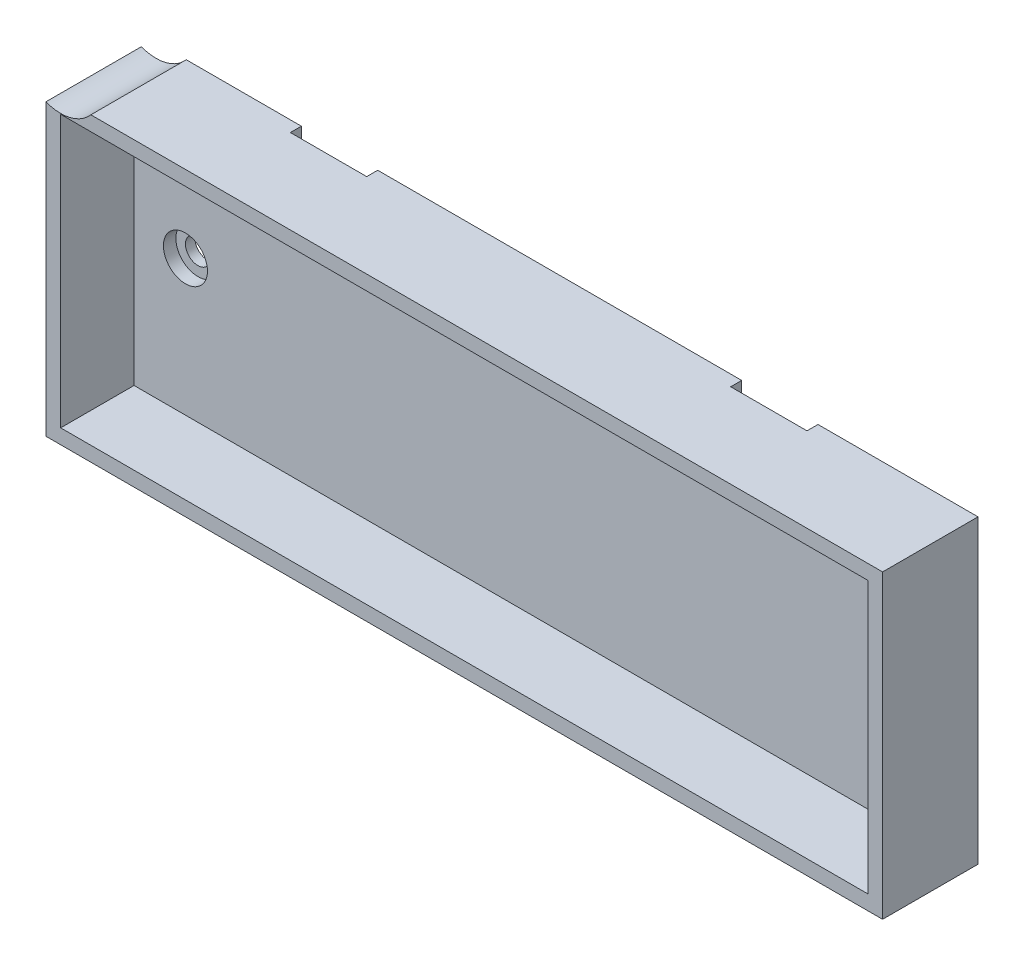
ISO-10303-21;
HEADER;
FILE_DESCRIPTION(('STEP AP214'),'2;1');
FILE_NAME('part.step','',(''),(''),'','','');
FILE_SCHEMA(('AUTOMOTIVE_DESIGN { 1 0 10303 214 1 1 1 1 }'));
ENDSEC;
DATA;
#1=APPLICATION_CONTEXT('core data for automotive mechanical design processes');
#2=APPLICATION_PROTOCOL_DEFINITION('international standard','automotive_design',2000,#1);
#3=PRODUCT_CONTEXT('',#1,'mechanical');
#4=PRODUCT('Part','Part','',(#3));
#5=PRODUCT_RELATED_PRODUCT_CATEGORY('part','',(#4));
#6=PRODUCT_DEFINITION_FORMATION('','',#4);
#7=PRODUCT_DEFINITION_CONTEXT('part definition',#1,'design');
#8=PRODUCT_DEFINITION('design','',#6,#7);
#9=PRODUCT_DEFINITION_SHAPE('','',#8);
#10=(LENGTH_UNIT() NAMED_UNIT(*) SI_UNIT(.MILLI.,.METRE.));
#11=(NAMED_UNIT(*) PLANE_ANGLE_UNIT() SI_UNIT($,.RADIAN.));
#12=(NAMED_UNIT(*) SI_UNIT($,.STERADIAN.) SOLID_ANGLE_UNIT());
#13=UNCERTAINTY_MEASURE_WITH_UNIT(LENGTH_MEASURE(1.E-05),#10,'distance_accuracy_value','');
#14=(GEOMETRIC_REPRESENTATION_CONTEXT(3) GLOBAL_UNCERTAINTY_ASSIGNED_CONTEXT((#13)) GLOBAL_UNIT_ASSIGNED_CONTEXT((#10,
#11,#12)) REPRESENTATION_CONTEXT('',''));
#15=CARTESIAN_POINT('',(0.,0.,0.));
#16=DIRECTION('',(0.,0.,1.));
#17=DIRECTION('',(1.,0.,0.));
#18=AXIS2_PLACEMENT_3D('',#15,#16,#17);
#19=CARTESIAN_POINT('',(-269.999999999999,50.4999999999969,50.));
#20=DIRECTION('',(0.,0.,1.));
#21=DIRECTION('',(1.,0.,0.));
#22=AXIS2_PLACEMENT_3D('',#19,#20,#21);
#23=PLANE('',#22);
#24=DIRECTION('',(1.,0.,0.));
#25=VECTOR('',#24,1.);
#26=CARTESIAN_POINT('',(-272.,6.,50.));
#27=LINE('',#26,#25);
#28=CARTESIAN_POINT('',(-250.2,6.,50.));
#29=VERTEX_POINT('',#28);
#30=CARTESIAN_POINT('',(-239.8,6.,50.));
#31=VERTEX_POINT('',#30);
#32=EDGE_CURVE('E264',#29,#31,#27,.T.);
#33=ORIENTED_EDGE('',*,*,#32,.F.);
#34=DIRECTION('',(0.,1.,0.));
#35=VECTOR('',#34,1.);
#36=CARTESIAN_POINT('',(-250.2,47.,50.));
#37=LINE('',#36,#35);
#38=CARTESIAN_POINT('',(-250.2,47.0000000000001,50.));
#39=VERTEX_POINT('',#38);
#40=EDGE_CURVE('E230',#29,#39,#37,.T.);
#41=ORIENTED_EDGE('',*,*,#40,.T.);
#42=DIRECTION('',(-1.,0.,0.));
#43=VECTOR('',#42,1.);
#44=CARTESIAN_POINT('',(-265.887822961009,47.0000000000001,50.));
#45=LINE('',#44,#43);
#46=CARTESIAN_POINT('',(-239.8,47.,50.));
#47=VERTEX_POINT('',#46);
#48=EDGE_CURVE('E266',#47,#39,#45,.T.);
#49=ORIENTED_EDGE('',*,*,#48,.F.);
#50=DIRECTION('',(0.,-1.,0.));
#51=VECTOR('',#50,1.);
#52=CARTESIAN_POINT('',(-239.8,47.,50.));
#53=LINE('',#52,#51);
#54=EDGE_CURVE('E241',#47,#31,#53,.T.);
#55=ORIENTED_EDGE('',*,*,#54,.T.);
#56=EDGE_LOOP('',(#33,#41,#49,#55));
#57=FACE_BOUND('',#56,.T.);
#58=ADVANCED_FACE('F41',(#57),#23,.F.);
#59=CARTESIAN_POINT('',(-269.999999999999,50.4999999999969,51.5));
#60=DIRECTION('',(0.,0.,1.));
#61=DIRECTION('',(1.,0.,0.));
#62=AXIS2_PLACEMENT_3D('',#59,#60,#61);
#63=CYLINDRICAL_SURFACE('',#62,5.39999999999747);
#64=CARTESIAN_POINT('',(-269.999999999999,50.4999999999969,61.5));
#65=DIRECTION('',(0.,0.,-1.));
#66=DIRECTION('',(1.,0.,0.));
#67=AXIS2_PLACEMENT_3D('',#64,#65,#66);
#68=CIRCLE('',#67,5.39999999999747);
#69=CARTESIAN_POINT('',(-265.887822961009,47.0000000000001,61.5));
#70=VERTEX_POINT('',#69);
#71=CARTESIAN_POINT('',(-272.,45.4840255184062,61.5));
#72=VERTEX_POINT('',#71);
#73=EDGE_CURVE('E296',#70,#72,#68,.T.);
#74=ORIENTED_EDGE('',*,*,#73,.F.);
#75=DIRECTION('',(0.,0.,1.));
#76=VECTOR('',#75,1.);
#77=CARTESIAN_POINT('',(-265.887822961009,47.0000000000001,51.5));
#78=LINE('',#77,#76);
#79=CARTESIAN_POINT('',(-265.887822961009,47.0000000000001,48.5));
#80=VERTEX_POINT('',#79);
#81=EDGE_CURVE('E11',#80,#70,#78,.T.);
#82=ORIENTED_EDGE('',*,*,#81,.F.);
#83=CARTESIAN_POINT('',(-269.999999999999,50.4999999999969,48.5));
#84=DIRECTION('',(0.,0.,-1.));
#85=DIRECTION('',(1.,0.,0.));
#86=AXIS2_PLACEMENT_3D('',#83,#84,#85);
#87=CIRCLE('',#86,5.39999999999747);
#88=CARTESIAN_POINT('',(-272.,45.4840255184062,48.5));
#89=VERTEX_POINT('',#88);
#90=EDGE_CURVE('E178',#80,#89,#87,.T.);
#91=ORIENTED_EDGE('',*,*,#90,.T.);
#92=DIRECTION('',(0.,0.,1.));
#93=VECTOR('',#92,1.);
#94=CARTESIAN_POINT('',(-272.,45.4840255184062,51.5));
#95=LINE('',#94,#93);
#96=EDGE_CURVE('E44',#89,#72,#95,.T.);
#97=ORIENTED_EDGE('',*,*,#96,.T.);
#98=EDGE_LOOP('',(#74,#82,#91,#97));
#99=FACE_BOUND('',#98,.T.);
#100=ADVANCED_FACE('F43',(#99),#63,.F.);
#101=CARTESIAN_POINT('',(-265.887822961009,47.0000000000001,51.5));
#102=DIRECTION('',(0.,1.,0.));
#103=DIRECTION('',(-1.,0.,0.));
#104=AXIS2_PLACEMENT_3D('',#101,#102,#103);
#105=PLANE('',#104);
#106=DIRECTION('',(-1.,0.,0.));
#107=VECTOR('',#106,1.);
#108=CARTESIAN_POINT('',(-265.887822961009,47.0000000000001,61.5));
#109=LINE('',#108,#107);
#110=CARTESIAN_POINT('',(-158.,47.,61.5));
#111=VERTEX_POINT('',#110);
#112=EDGE_CURVE('E174',#111,#70,#109,.T.);
#113=ORIENTED_EDGE('',*,*,#112,.F.);
#114=DIRECTION('',(0.,0.,1.));
#115=VECTOR('',#114,1.);
#116=CARTESIAN_POINT('',(-158.,47.,51.5));
#117=LINE('',#116,#115);
#118=CARTESIAN_POINT('',(-158.,47.,48.5));
#119=VERTEX_POINT('',#118);
#120=EDGE_CURVE('E49',#119,#111,#117,.T.);
#121=ORIENTED_EDGE('',*,*,#120,.F.);
#122=DIRECTION('',(-1.,0.,0.));
#123=VECTOR('',#122,1.);
#124=CARTESIAN_POINT('',(-179.8,47.,48.5));
#125=LINE('',#124,#123);
#126=CARTESIAN_POINT('',(-179.8,47.,48.5));
#127=VERTEX_POINT('',#126);
#128=EDGE_CURVE('E211',#119,#127,#125,.T.);
#129=ORIENTED_EDGE('',*,*,#128,.T.);
#130=DIRECTION('',(0.,0.,1.));
#131=VECTOR('',#130,1.);
#132=CARTESIAN_POINT('',(-179.8,47.,49.8));
#133=LINE('',#132,#131);
#134=CARTESIAN_POINT('',(-179.8,47.,50.));
#135=VERTEX_POINT('',#134);
#136=EDGE_CURVE('E239',#127,#135,#133,.T.);
#137=ORIENTED_EDGE('',*,*,#136,.T.);
#138=CARTESIAN_POINT('',(-190.2,47.,50.));
#139=VERTEX_POINT('',#138);
#140=EDGE_CURVE('E267',#135,#139,#45,.T.);
#141=ORIENTED_EDGE('',*,*,#140,.T.);
#142=DIRECTION('',(0.,0.,1.));
#143=VECTOR('',#142,1.);
#144=CARTESIAN_POINT('',(-190.2,47.,49.8));
#145=LINE('',#144,#143);
#146=CARTESIAN_POINT('',(-190.2,47.,48.5));
#147=VERTEX_POINT('',#146);
#148=EDGE_CURVE('E250',#147,#139,#145,.T.);
#149=ORIENTED_EDGE('',*,*,#148,.F.);
#150=DIRECTION('',(-1.,0.,0.));
#151=VECTOR('',#150,1.);
#152=CARTESIAN_POINT('',(-239.8,47.,48.5));
#153=LINE('',#152,#151);
#154=CARTESIAN_POINT('',(-239.8,47.,48.5));
#155=VERTEX_POINT('',#154);
#156=EDGE_CURVE('E196',#147,#155,#153,.T.);
#157=ORIENTED_EDGE('',*,*,#156,.T.);
#158=DIRECTION('',(0.,0.,1.));
#159=VECTOR('',#158,1.);
#160=CARTESIAN_POINT('',(-239.8,47.,49.8));
#161=LINE('',#160,#159);
#162=EDGE_CURVE('E197',#155,#47,#161,.T.);
#163=ORIENTED_EDGE('',*,*,#162,.T.);
#164=ORIENTED_EDGE('',*,*,#48,.T.);
#165=DIRECTION('',(0.,0.,1.));
#166=VECTOR('',#165,1.);
#167=CARTESIAN_POINT('',(-250.2,47.,49.8));
#168=LINE('',#167,#166);
#169=CARTESIAN_POINT('',(-250.2,47.,48.5));
#170=VERTEX_POINT('',#169);
#171=EDGE_CURVE('E66',#170,#39,#168,.T.);
#172=ORIENTED_EDGE('',*,*,#171,.F.);
#173=DIRECTION('',(-1.,0.,0.));
#174=VECTOR('',#173,1.);
#175=CARTESIAN_POINT('',(-265.887822961009,47.0000000000001,48.5));
#176=LINE('',#175,#174);
#177=EDGE_CURVE('E195',#170,#80,#176,.T.);
#178=ORIENTED_EDGE('',*,*,#177,.T.);
#179=ORIENTED_EDGE('',*,*,#81,.T.);
#180=EDGE_LOOP('',(#113,#121,#129,#137,#141,#149,#157,#163,#164,#172,#178,#179));
#181=FACE_BOUND('',#180,.T.);
#182=ADVANCED_FACE('F323',(#181),#105,.T.);
#183=CARTESIAN_POINT('',(-158.,47.,51.5));
#184=DIRECTION('',(1.,0.,0.));
#185=DIRECTION('',(0.,0.,-1.));
#186=AXIS2_PLACEMENT_3D('',#183,#184,#185);
#187=PLANE('',#186);
#188=DIRECTION('',(0.,1.,0.));
#189=VECTOR('',#188,1.);
#190=CARTESIAN_POINT('',(-158.,47.,61.5));
#191=LINE('',#190,#189);
#192=CARTESIAN_POINT('',(-158.,6.,61.5));
#193=VERTEX_POINT('',#192);
#194=EDGE_CURVE('E306',#193,#111,#191,.T.);
#195=ORIENTED_EDGE('',*,*,#194,.F.);
#196=DIRECTION('',(0.,0.,1.));
#197=VECTOR('',#196,1.);
#198=CARTESIAN_POINT('',(-158.,6.,51.5));
#199=LINE('',#198,#197);
#200=CARTESIAN_POINT('',(-158.,6.,48.5));
#201=VERTEX_POINT('',#200);
#202=EDGE_CURVE('E314',#201,#193,#199,.T.);
#203=ORIENTED_EDGE('',*,*,#202,.F.);
#204=DIRECTION('',(0.,1.,0.));
#205=VECTOR('',#204,1.);
#206=CARTESIAN_POINT('',(-158.,47.,48.5));
#207=LINE('',#206,#205);
#208=EDGE_CURVE('E212',#201,#119,#207,.T.);
#209=ORIENTED_EDGE('',*,*,#208,.T.);
#210=ORIENTED_EDGE('',*,*,#120,.T.);
#211=EDGE_LOOP('',(#195,#203,#209,#210));
#212=FACE_BOUND('',#211,.T.);
#213=ADVANCED_FACE('F353',(#212),#187,.T.);
#214=CARTESIAN_POINT('',(-272.,6.,51.5));
#215=DIRECTION('',(0.,-1.,0.));
#216=DIRECTION('',(0.,0.,-1.));
#217=AXIS2_PLACEMENT_3D('',#214,#215,#216);
#218=PLANE('',#217);
#219=DIRECTION('',(1.,0.,0.));
#220=VECTOR('',#219,1.);
#221=CARTESIAN_POINT('',(-272.,6.,61.5));
#222=LINE('',#221,#220);
#223=CARTESIAN_POINT('',(-272.,6.,61.5));
#224=VERTEX_POINT('',#223);
#225=EDGE_CURVE('E305',#224,#193,#222,.T.);
#226=ORIENTED_EDGE('',*,*,#225,.F.);
#227=DIRECTION('',(0.,0.,1.));
#228=VECTOR('',#227,1.);
#229=CARTESIAN_POINT('',(-272.,6.,51.5));
#230=LINE('',#229,#228);
#231=CARTESIAN_POINT('',(-272.,6.,48.5));
#232=VERTEX_POINT('',#231);
#233=EDGE_CURVE('E172',#232,#224,#230,.T.);
#234=ORIENTED_EDGE('',*,*,#233,.F.);
#235=DIRECTION('',(1.,0.,0.));
#236=VECTOR('',#235,1.);
#237=CARTESIAN_POINT('',(-272.,6.,48.5));
#238=LINE('',#237,#236);
#239=CARTESIAN_POINT('',(-250.2,6.,48.5));
#240=VERTEX_POINT('',#239);
#241=EDGE_CURVE('E181',#232,#240,#238,.T.);
#242=ORIENTED_EDGE('',*,*,#241,.T.);
#243=DIRECTION('',(0.,0.,1.));
#244=VECTOR('',#243,1.);
#245=CARTESIAN_POINT('',(-250.2,6.,49.8));
#246=LINE('',#245,#244);
#247=EDGE_CURVE('E234',#240,#29,#246,.T.);
#248=ORIENTED_EDGE('',*,*,#247,.T.);
#249=ORIENTED_EDGE('',*,*,#32,.T.);
#250=DIRECTION('',(0.,0.,1.));
#251=VECTOR('',#250,1.);
#252=CARTESIAN_POINT('',(-239.8,6.,49.8));
#253=LINE('',#252,#251);
#254=CARTESIAN_POINT('',(-239.8,6.,48.5));
#255=VERTEX_POINT('',#254);
#256=EDGE_CURVE('E245',#255,#31,#253,.T.);
#257=ORIENTED_EDGE('',*,*,#256,.F.);
#258=DIRECTION('',(1.,0.,0.));
#259=VECTOR('',#258,1.);
#260=CARTESIAN_POINT('',(-239.8,6.,48.5));
#261=LINE('',#260,#259);
#262=CARTESIAN_POINT('',(-190.2,6.,48.5));
#263=VERTEX_POINT('',#262);
#264=EDGE_CURVE('E202',#255,#263,#261,.T.);
#265=ORIENTED_EDGE('',*,*,#264,.T.);
#266=DIRECTION('',(0.,0.,1.));
#267=VECTOR('',#266,1.);
#268=CARTESIAN_POINT('',(-190.2,6.,49.8));
#269=LINE('',#268,#267);
#270=CARTESIAN_POINT('',(-190.2,6.,50.));
#271=VERTEX_POINT('',#270);
#272=EDGE_CURVE('E249',#263,#271,#269,.T.);
#273=ORIENTED_EDGE('',*,*,#272,.T.);
#274=CARTESIAN_POINT('',(-179.8,6.,50.));
#275=VERTEX_POINT('',#274);
#276=EDGE_CURVE('E265',#271,#275,#27,.T.);
#277=ORIENTED_EDGE('',*,*,#276,.T.);
#278=DIRECTION('',(0.,0.,1.));
#279=VECTOR('',#278,1.);
#280=CARTESIAN_POINT('',(-179.8,6.,49.8));
#281=LINE('',#280,#279);
#282=CARTESIAN_POINT('',(-179.8,6.,48.5));
#283=VERTEX_POINT('',#282);
#284=EDGE_CURVE('E59',#283,#275,#281,.T.);
#285=ORIENTED_EDGE('',*,*,#284,.F.);
#286=DIRECTION('',(1.,0.,0.));
#287=VECTOR('',#286,1.);
#288=CARTESIAN_POINT('',(-179.8,6.,48.5));
#289=LINE('',#288,#287);
#290=EDGE_CURVE('E220',#283,#201,#289,.T.);
#291=ORIENTED_EDGE('',*,*,#290,.T.);
#292=ORIENTED_EDGE('',*,*,#202,.T.);
#293=EDGE_LOOP('',(#226,#234,#242,#248,#249,#257,#265,#273,#277,#285,#291,#292));
#294=FACE_BOUND('',#293,.T.);
#295=ADVANCED_FACE('F320',(#294),#218,.T.);
#296=CARTESIAN_POINT('',(-272.,45.4840255184062,51.5));
#297=DIRECTION('',(-1.,0.,0.));
#298=DIRECTION('',(0.,0.,1.));
#299=AXIS2_PLACEMENT_3D('',#296,#297,#298);
#300=PLANE('',#299);
#301=DIRECTION('',(0.,-1.,0.));
#302=VECTOR('',#301,1.);
#303=CARTESIAN_POINT('',(-272.,45.4840255184062,61.5));
#304=LINE('',#303,#302);
#305=EDGE_CURVE('E170',#72,#224,#304,.T.);
#306=ORIENTED_EDGE('',*,*,#305,.F.);
#307=ORIENTED_EDGE('',*,*,#96,.F.);
#308=DIRECTION('',(0.,-1.,0.));
#309=VECTOR('',#308,1.);
#310=CARTESIAN_POINT('',(-272.,45.4840255184062,48.5));
#311=LINE('',#310,#309);
#312=EDGE_CURVE('E164',#89,#232,#311,.T.);
#313=ORIENTED_EDGE('',*,*,#312,.T.);
#314=ORIENTED_EDGE('',*,*,#233,.T.);
#315=EDGE_LOOP('',(#306,#307,#313,#314));
#316=FACE_BOUND('',#315,.T.);
#317=ADVANCED_FACE('F163',(#316),#300,.T.);
#318=CARTESIAN_POINT('',(-269.999999999999,50.4999999999969,61.5));
#319=DIRECTION('',(0.,0.,1.));
#320=DIRECTION('',(1.,0.,0.));
#321=AXIS2_PLACEMENT_3D('',#318,#319,#320);
#322=PLANE('',#321);
#323=DIRECTION('',(-1.,0.,0.));
#324=VECTOR('',#323,1.);
#325=CARTESIAN_POINT('',(-270.,45.,61.5));
#326=LINE('',#325,#324);
#327=CARTESIAN_POINT('',(-160.,45.,61.5));
#328=VERTEX_POINT('',#327);
#329=CARTESIAN_POINT('',(-270.,45.,61.5));
#330=VERTEX_POINT('',#329);
#331=EDGE_CURVE('E283',#328,#330,#326,.T.);
#332=ORIENTED_EDGE('',*,*,#331,.F.);
#333=DIRECTION('',(0.,1.,0.));
#334=VECTOR('',#333,1.);
#335=CARTESIAN_POINT('',(-160.,45.,61.5));
#336=LINE('',#335,#334);
#337=CARTESIAN_POINT('',(-160.,8.,61.5));
#338=VERTEX_POINT('',#337);
#339=EDGE_CURVE('E273',#338,#328,#336,.T.);
#340=ORIENTED_EDGE('',*,*,#339,.F.);
#341=DIRECTION('',(1.,0.,0.));
#342=VECTOR('',#341,1.);
#343=CARTESIAN_POINT('',(-270.,8.,61.5));
#344=LINE('',#343,#342);
#345=CARTESIAN_POINT('',(-270.,8.,61.5));
#346=VERTEX_POINT('',#345);
#347=EDGE_CURVE('E288',#346,#338,#344,.T.);
#348=ORIENTED_EDGE('',*,*,#347,.F.);
#349=DIRECTION('',(0.,-1.,0.));
#350=VECTOR('',#349,1.);
#351=CARTESIAN_POINT('',(-270.,45.,61.5));
#352=LINE('',#351,#350);
#353=EDGE_CURVE('E286',#330,#346,#352,.T.);
#354=ORIENTED_EDGE('',*,*,#353,.F.);
#355=EDGE_LOOP('',(#332,#340,#348,#354));
#356=FACE_BOUND('',#355,.T.);
#357=ORIENTED_EDGE('',*,*,#73,.T.);
#358=ORIENTED_EDGE('',*,*,#305,.T.);
#359=ORIENTED_EDGE('',*,*,#225,.T.);
#360=ORIENTED_EDGE('',*,*,#194,.T.);
#361=ORIENTED_EDGE('',*,*,#112,.T.);
#362=EDGE_LOOP('',(#357,#358,#359,#360,#361));
#363=FACE_BOUND('',#362,.T.);
#364=ADVANCED_FACE('F319',(#356,#363),#322,.T.);
#365=CARTESIAN_POINT('',(-270.,45.,51.5));
#366=DIRECTION('',(0.,1.,0.));
#367=DIRECTION('',(0.,0.,1.));
#368=AXIS2_PLACEMENT_3D('',#365,#366,#367);
#369=PLANE('',#368);
#370=ORIENTED_EDGE('',*,*,#331,.T.);
#371=DIRECTION('',(0.,0.,1.));
#372=VECTOR('',#371,1.);
#373=CARTESIAN_POINT('',(-270.,45.,51.5));
#374=LINE('',#373,#372);
#375=CARTESIAN_POINT('',(-270.,45.,51.5));
#376=VERTEX_POINT('',#375);
#377=EDGE_CURVE('E284',#376,#330,#374,.T.);
#378=ORIENTED_EDGE('',*,*,#377,.F.);
#379=DIRECTION('',(-1.,0.,0.));
#380=VECTOR('',#379,1.);
#381=CARTESIAN_POINT('',(-270.,45.,51.5));
#382=LINE('',#381,#380);
#383=CARTESIAN_POINT('',(-160.,45.,51.5));
#384=VERTEX_POINT('',#383);
#385=EDGE_CURVE('E269',#384,#376,#382,.T.);
#386=ORIENTED_EDGE('',*,*,#385,.F.);
#387=DIRECTION('',(0.,0.,1.));
#388=VECTOR('',#387,1.);
#389=CARTESIAN_POINT('',(-160.,45.,51.5));
#390=LINE('',#389,#388);
#391=EDGE_CURVE('E294',#384,#328,#390,.T.);
#392=ORIENTED_EDGE('',*,*,#391,.T.);
#393=EDGE_LOOP('',(#370,#378,#386,#392));
#394=FACE_BOUND('',#393,.T.);
#395=ADVANCED_FACE('F391',(#394),#369,.F.);
#396=CARTESIAN_POINT('',(-160.,45.,51.5));
#397=DIRECTION('',(1.,0.,0.));
#398=DIRECTION('',(0.,0.,-1.));
#399=AXIS2_PLACEMENT_3D('',#396,#397,#398);
#400=PLANE('',#399);
#401=ORIENTED_EDGE('',*,*,#339,.T.);
#402=ORIENTED_EDGE('',*,*,#391,.F.);
#403=DIRECTION('',(0.,1.,0.));
#404=VECTOR('',#403,1.);
#405=CARTESIAN_POINT('',(-160.,45.,51.5));
#406=LINE('',#405,#404);
#407=CARTESIAN_POINT('',(-160.,8.,51.5));
#408=VERTEX_POINT('',#407);
#409=EDGE_CURVE('E278',#408,#384,#406,.T.);
#410=ORIENTED_EDGE('',*,*,#409,.F.);
#411=DIRECTION('',(0.,0.,1.));
#412=VECTOR('',#411,1.);
#413=CARTESIAN_POINT('',(-160.,8.,51.5));
#414=LINE('',#413,#412);
#415=EDGE_CURVE('E297',#408,#338,#414,.T.);
#416=ORIENTED_EDGE('',*,*,#415,.T.);
#417=EDGE_LOOP('',(#401,#402,#410,#416));
#418=FACE_BOUND('',#417,.T.);
#419=ADVANCED_FACE('F387',(#418),#400,.F.);
#420=CARTESIAN_POINT('',(-270.,8.,51.5));
#421=DIRECTION('',(0.,-1.,0.));
#422=DIRECTION('',(0.,0.,-1.));
#423=AXIS2_PLACEMENT_3D('',#420,#421,#422);
#424=PLANE('',#423);
#425=ORIENTED_EDGE('',*,*,#347,.T.);
#426=ORIENTED_EDGE('',*,*,#415,.F.);
#427=DIRECTION('',(1.,0.,0.));
#428=VECTOR('',#427,1.);
#429=CARTESIAN_POINT('',(-270.,8.,51.5));
#430=LINE('',#429,#428);
#431=CARTESIAN_POINT('',(-270.,8.,51.5));
#432=VERTEX_POINT('',#431);
#433=EDGE_CURVE('E280',#432,#408,#430,.T.);
#434=ORIENTED_EDGE('',*,*,#433,.F.);
#435=DIRECTION('',(0.,0.,1.));
#436=VECTOR('',#435,1.);
#437=CARTESIAN_POINT('',(-270.,8.,51.5));
#438=LINE('',#437,#436);
#439=EDGE_CURVE('E298',#432,#346,#438,.T.);
#440=ORIENTED_EDGE('',*,*,#439,.T.);
#441=EDGE_LOOP('',(#425,#426,#434,#440));
#442=FACE_BOUND('',#441,.T.);
#443=ADVANCED_FACE('F379',(#442),#424,.F.);
#444=CARTESIAN_POINT('',(-270.,45.,51.5));
#445=DIRECTION('',(-1.,0.,0.));
#446=DIRECTION('',(0.,0.,1.));
#447=AXIS2_PLACEMENT_3D('',#444,#445,#446);
#448=PLANE('',#447);
#449=ORIENTED_EDGE('',*,*,#353,.T.);
#450=ORIENTED_EDGE('',*,*,#439,.F.);
#451=DIRECTION('',(0.,-1.,0.));
#452=VECTOR('',#451,1.);
#453=CARTESIAN_POINT('',(-270.,45.,51.5));
#454=LINE('',#453,#452);
#455=EDGE_CURVE('E272',#376,#432,#454,.T.);
#456=ORIENTED_EDGE('',*,*,#455,.F.);
#457=ORIENTED_EDGE('',*,*,#377,.T.);
#458=EDGE_LOOP('',(#449,#450,#456,#457));
#459=FACE_BOUND('',#458,.T.);
#460=ADVANCED_FACE('F373',(#459),#448,.F.);
#461=ORIENTED_EDGE('',*,*,#140,.F.);
#462=DIRECTION('',(0.,-1.,0.));
#463=VECTOR('',#462,1.);
#464=CARTESIAN_POINT('',(-179.8,47.,50.));
#465=LINE('',#464,#463);
#466=EDGE_CURVE('E236',#135,#275,#465,.T.);
#467=ORIENTED_EDGE('',*,*,#466,.T.);
#468=ORIENTED_EDGE('',*,*,#276,.F.);
#469=DIRECTION('',(0.,1.,0.));
#470=VECTOR('',#469,1.);
#471=CARTESIAN_POINT('',(-190.2,47.,50.));
#472=LINE('',#471,#470);
#473=EDGE_CURVE('E247',#271,#139,#472,.T.);
#474=ORIENTED_EDGE('',*,*,#473,.T.);
#475=EDGE_LOOP('',(#461,#467,#468,#474));
#476=FACE_BOUND('',#475,.T.);
#477=ADVANCED_FACE('F345',(#476),#23,.F.);
#478=CARTESIAN_POINT('',(-269.999999999999,50.4999999999969,51.5));
#479=DIRECTION('',(0.,0.,1.));
#480=DIRECTION('',(1.,0.,0.));
#481=AXIS2_PLACEMENT_3D('',#478,#479,#480);
#482=PLANE('',#481);
#483=ORIENTED_EDGE('',*,*,#433,.T.);
#484=ORIENTED_EDGE('',*,*,#409,.T.);
#485=ORIENTED_EDGE('',*,*,#385,.T.);
#486=ORIENTED_EDGE('',*,*,#455,.T.);
#487=EDGE_LOOP('',(#483,#484,#485,#486));
#488=FACE_BOUND('',#487,.T.);
#489=CARTESIAN_POINT('',(-167.,26.5,51.5));
#490=DIRECTION('',(0.,0.,1.));
#491=DIRECTION('',(1.,0.,0.));
#492=AXIS2_PLACEMENT_3D('',#489,#490,#491);
#493=CIRCLE('',#492,3.);
#494=CARTESIAN_POINT('',(-164.,26.5,51.5));
#495=VERTEX_POINT('',#494);
#496=EDGE_CURVE('E235',#495,#495,#493,.T.);
#497=ORIENTED_EDGE('',*,*,#496,.F.);
#498=EDGE_LOOP('',(#497));
#499=FACE_BOUND('',#498,.T.);
#500=CARTESIAN_POINT('',(-263.,26.5,51.5));
#501=DIRECTION('',(0.,0.,1.));
#502=DIRECTION('',(1.,0.,0.));
#503=AXIS2_PLACEMENT_3D('',#500,#501,#502);
#504=CIRCLE('',#503,3.);
#505=CARTESIAN_POINT('',(-260.,26.5,51.5));
#506=VERTEX_POINT('',#505);
#507=EDGE_CURVE('E259',#506,#506,#504,.T.);
#508=ORIENTED_EDGE('',*,*,#507,.F.);
#509=EDGE_LOOP('',(#508));
#510=FACE_BOUND('',#509,.T.);
#511=ADVANCED_FACE('F375',(#488,#499,#510),#482,.T.);
#512=CARTESIAN_POINT('',(-263.,26.5,50.));
#513=DIRECTION('',(0.,0.,1.));
#514=DIRECTION('',(1.,0.,0.));
#515=AXIS2_PLACEMENT_3D('',#512,#513,#514);
#516=CYLINDRICAL_SURFACE('',#515,3.);
#517=ORIENTED_EDGE('',*,*,#507,.T.);
#518=EDGE_LOOP('',(#517));
#519=FACE_BOUND('',#518,.T.);
#520=CARTESIAN_POINT('',(-263.,26.5,49.8));
#521=DIRECTION('',(0.,0.,1.));
#522=DIRECTION('',(1.,0.,0.));
#523=AXIS2_PLACEMENT_3D('',#520,#521,#522);
#524=CIRCLE('',#523,3.);
#525=CARTESIAN_POINT('',(-260.,26.5,49.8));
#526=VERTEX_POINT('',#525);
#527=EDGE_CURVE('E227',#526,#526,#524,.T.);
#528=ORIENTED_EDGE('',*,*,#527,.F.);
#529=EDGE_LOOP('',(#528));
#530=FACE_BOUND('',#529,.T.);
#531=ADVANCED_FACE('F380',(#519,#530),#516,.F.);
#532=CARTESIAN_POINT('',(-167.,26.5,50.));
#533=DIRECTION('',(0.,0.,1.));
#534=DIRECTION('',(1.,0.,0.));
#535=AXIS2_PLACEMENT_3D('',#532,#533,#534);
#536=CYLINDRICAL_SURFACE('',#535,3.);
#537=ORIENTED_EDGE('',*,*,#496,.T.);
#538=EDGE_LOOP('',(#537));
#539=FACE_BOUND('',#538,.T.);
#540=CARTESIAN_POINT('',(-167.,26.5,49.8));
#541=DIRECTION('',(0.,0.,1.));
#542=DIRECTION('',(1.,0.,0.));
#543=AXIS2_PLACEMENT_3D('',#540,#541,#542);
#544=CIRCLE('',#543,3.);
#545=CARTESIAN_POINT('',(-164.,26.5,49.8));
#546=VERTEX_POINT('',#545);
#547=EDGE_CURVE('E231',#546,#546,#544,.T.);
#548=ORIENTED_EDGE('',*,*,#547,.F.);
#549=EDGE_LOOP('',(#548));
#550=FACE_BOUND('',#549,.T.);
#551=ADVANCED_FACE('F501',(#539,#550),#536,.F.);
#552=CARTESIAN_POINT('',(-239.8,47.,49.8));
#553=DIRECTION('',(-1.,0.,0.));
#554=DIRECTION('',(0.,0.,1.));
#555=AXIS2_PLACEMENT_3D('',#552,#553,#554);
#556=PLANE('',#555);
#557=ORIENTED_EDGE('',*,*,#54,.F.);
#558=ORIENTED_EDGE('',*,*,#162,.F.);
#559=DIRECTION('',(0.,-1.,0.));
#560=VECTOR('',#559,1.);
#561=CARTESIAN_POINT('',(-239.8,47.,48.5));
#562=LINE('',#561,#560);
#563=EDGE_CURVE('E208',#155,#255,#562,.T.);
#564=ORIENTED_EDGE('',*,*,#563,.T.);
#565=ORIENTED_EDGE('',*,*,#256,.T.);
#566=EDGE_LOOP('',(#557,#558,#564,#565));
#567=FACE_BOUND('',#566,.T.);
#568=ADVANCED_FACE('F332',(#567),#556,.T.);
#569=CARTESIAN_POINT('',(-190.2,47.,49.8));
#570=DIRECTION('',(1.,0.,0.));
#571=DIRECTION('',(0.,0.,-1.));
#572=AXIS2_PLACEMENT_3D('',#569,#570,#571);
#573=PLANE('',#572);
#574=ORIENTED_EDGE('',*,*,#473,.F.);
#575=ORIENTED_EDGE('',*,*,#272,.F.);
#576=DIRECTION('',(0.,1.,0.));
#577=VECTOR('',#576,1.);
#578=CARTESIAN_POINT('',(-190.2,47.,48.5));
#579=LINE('',#578,#577);
#580=EDGE_CURVE('E203',#263,#147,#579,.T.);
#581=ORIENTED_EDGE('',*,*,#580,.T.);
#582=ORIENTED_EDGE('',*,*,#148,.T.);
#583=EDGE_LOOP('',(#574,#575,#581,#582));
#584=FACE_BOUND('',#583,.T.);
#585=ADVANCED_FACE('F340',(#584),#573,.T.);
#586=CARTESIAN_POINT('',(-179.8,47.,49.8));
#587=DIRECTION('',(-1.,0.,0.));
#588=DIRECTION('',(0.,0.,1.));
#589=AXIS2_PLACEMENT_3D('',#586,#587,#588);
#590=PLANE('',#589);
#591=ORIENTED_EDGE('',*,*,#466,.F.);
#592=ORIENTED_EDGE('',*,*,#136,.F.);
#593=DIRECTION('',(0.,-1.,0.));
#594=VECTOR('',#593,1.);
#595=CARTESIAN_POINT('',(-179.8,47.,48.5));
#596=LINE('',#595,#594);
#597=EDGE_CURVE('E219',#127,#283,#596,.T.);
#598=ORIENTED_EDGE('',*,*,#597,.T.);
#599=ORIENTED_EDGE('',*,*,#284,.T.);
#600=EDGE_LOOP('',(#591,#592,#598,#599));
#601=FACE_BOUND('',#600,.T.);
#602=ADVANCED_FACE('F350',(#601),#590,.T.);
#603=CARTESIAN_POINT('',(-250.2,47.,49.8));
#604=DIRECTION('',(1.,0.,0.));
#605=DIRECTION('',(0.,0.,-1.));
#606=AXIS2_PLACEMENT_3D('',#603,#604,#605);
#607=PLANE('',#606);
#608=ORIENTED_EDGE('',*,*,#40,.F.);
#609=ORIENTED_EDGE('',*,*,#247,.F.);
#610=DIRECTION('',(0.,1.,0.));
#611=VECTOR('',#610,1.);
#612=CARTESIAN_POINT('',(-250.2,47.,48.5));
#613=LINE('',#612,#611);
#614=EDGE_CURVE('E194',#240,#170,#613,.T.);
#615=ORIENTED_EDGE('',*,*,#614,.T.);
#616=ORIENTED_EDGE('',*,*,#171,.T.);
#617=EDGE_LOOP('',(#608,#609,#615,#616));
#618=FACE_BOUND('',#617,.T.);
#619=ADVANCED_FACE('F326',(#618),#607,.T.);
#620=CARTESIAN_POINT('',(0.,0.,49.8));
#621=DIRECTION('',(0.,0.,1.));
#622=DIRECTION('',(1.,0.,0.));
#623=AXIS2_PLACEMENT_3D('',#620,#621,#622);
#624=PLANE('',#623);
#625=CARTESIAN_POINT('',(-167.,26.5,49.8));
#626=DIRECTION('',(0.,0.,1.));
#627=DIRECTION('',(1.,0.,0.));
#628=AXIS2_PLACEMENT_3D('',#625,#626,#627);
#629=CIRCLE('',#628,1.70000000000001);
#630=CARTESIAN_POINT('',(-165.3,26.5,49.8));
#631=VERTEX_POINT('',#630);
#632=EDGE_CURVE('E205',#631,#631,#629,.T.);
#633=ORIENTED_EDGE('',*,*,#632,.F.);
#634=EDGE_LOOP('',(#633));
#635=FACE_BOUND('',#634,.T.);
#636=ORIENTED_EDGE('',*,*,#547,.T.);
#637=EDGE_LOOP('',(#636));
#638=FACE_BOUND('',#637,.T.);
#639=ADVANCED_FACE('F547',(#635,#638),#624,.T.);
#640=CARTESIAN_POINT('',(0.,0.,48.5));
#641=DIRECTION('',(0.,0.,1.));
#642=DIRECTION('',(1.,0.,0.));
#643=AXIS2_PLACEMENT_3D('',#640,#641,#642);
#644=PLANE('',#643);
#645=CARTESIAN_POINT('',(-167.,26.5,48.5));
#646=DIRECTION('',(0.,0.,1.));
#647=DIRECTION('',(1.,0.,0.));
#648=AXIS2_PLACEMENT_3D('',#645,#646,#647);
#649=CIRCLE('',#648,1.70000000000001);
#650=CARTESIAN_POINT('',(-165.3,26.5,48.5));
#651=VERTEX_POINT('',#650);
#652=EDGE_CURVE('E225',#651,#651,#649,.T.);
#653=ORIENTED_EDGE('',*,*,#652,.T.);
#654=EDGE_LOOP('',(#653));
#655=FACE_BOUND('',#654,.T.);
#656=ORIENTED_EDGE('',*,*,#597,.F.);
#657=ORIENTED_EDGE('',*,*,#128,.F.);
#658=ORIENTED_EDGE('',*,*,#208,.F.);
#659=ORIENTED_EDGE('',*,*,#290,.F.);
#660=EDGE_LOOP('',(#656,#657,#658,#659));
#661=FACE_BOUND('',#660,.T.);
#662=ADVANCED_FACE('F351',(#655,#661),#644,.F.);
#663=CARTESIAN_POINT('',(-167.,26.5,48.5));
#664=DIRECTION('',(0.,0.,1.));
#665=DIRECTION('',(1.,0.,0.));
#666=AXIS2_PLACEMENT_3D('',#663,#664,#665);
#667=CYLINDRICAL_SURFACE('',#666,1.70000000000001);
#668=ORIENTED_EDGE('',*,*,#652,.F.);
#669=EDGE_LOOP('',(#668));
#670=FACE_BOUND('',#669,.T.);
#671=ORIENTED_EDGE('',*,*,#632,.T.);
#672=EDGE_LOOP('',(#671));
#673=FACE_BOUND('',#672,.T.);
#674=ADVANCED_FACE('F565',(#670,#673),#667,.F.);
#675=CARTESIAN_POINT('',(-269.999999999999,50.4999999999969,49.8));
#676=DIRECTION('',(0.,0.,1.));
#677=DIRECTION('',(1.,0.,0.));
#678=AXIS2_PLACEMENT_3D('',#675,#676,#677);
#679=PLANE('',#678);
#680=CARTESIAN_POINT('',(-263.,26.5,49.8));
#681=DIRECTION('',(0.,0.,1.));
#682=DIRECTION('',(1.,0.,0.));
#683=AXIS2_PLACEMENT_3D('',#680,#681,#682);
#684=CIRCLE('',#683,1.69999999999998);
#685=CARTESIAN_POINT('',(-261.3,26.5,49.8));
#686=VERTEX_POINT('',#685);
#687=EDGE_CURVE('E189',#686,#686,#684,.T.);
#688=ORIENTED_EDGE('',*,*,#687,.F.);
#689=EDGE_LOOP('',(#688));
#690=FACE_BOUND('',#689,.T.);
#691=ORIENTED_EDGE('',*,*,#527,.T.);
#692=EDGE_LOOP('',(#691));
#693=FACE_BOUND('',#692,.T.);
#694=ADVANCED_FACE('F573',(#690,#693),#679,.T.);
#695=CARTESIAN_POINT('',(-269.999999999999,50.4999999999969,48.5));
#696=DIRECTION('',(0.,0.,1.));
#697=DIRECTION('',(1.,0.,0.));
#698=AXIS2_PLACEMENT_3D('',#695,#696,#697);
#699=PLANE('',#698);
#700=CARTESIAN_POINT('',(-263.,26.5,48.5));
#701=DIRECTION('',(0.,0.,1.));
#702=DIRECTION('',(1.,0.,0.));
#703=AXIS2_PLACEMENT_3D('',#700,#701,#702);
#704=CIRCLE('',#703,1.69999999999998);
#705=CARTESIAN_POINT('',(-261.3,26.5,48.5));
#706=VERTEX_POINT('',#705);
#707=EDGE_CURVE('E183',#706,#706,#704,.T.);
#708=ORIENTED_EDGE('',*,*,#707,.T.);
#709=EDGE_LOOP('',(#708));
#710=FACE_BOUND('',#709,.T.);
#711=ORIENTED_EDGE('',*,*,#90,.F.);
#712=ORIENTED_EDGE('',*,*,#177,.F.);
#713=ORIENTED_EDGE('',*,*,#614,.F.);
#714=ORIENTED_EDGE('',*,*,#241,.F.);
#715=ORIENTED_EDGE('',*,*,#312,.F.);
#716=EDGE_LOOP('',(#711,#712,#713,#714,#715));
#717=FACE_BOUND('',#716,.T.);
#718=ADVANCED_FACE('F177',(#710,#717),#699,.F.);
#719=CARTESIAN_POINT('',(-263.,26.5,48.5));
#720=DIRECTION('',(0.,0.,1.));
#721=DIRECTION('',(1.,0.,0.));
#722=AXIS2_PLACEMENT_3D('',#719,#720,#721);
#723=CYLINDRICAL_SURFACE('',#722,1.69999999999998);
#724=ORIENTED_EDGE('',*,*,#707,.F.);
#725=EDGE_LOOP('',(#724));
#726=FACE_BOUND('',#725,.T.);
#727=ORIENTED_EDGE('',*,*,#687,.T.);
#728=EDGE_LOOP('',(#727));
#729=FACE_BOUND('',#728,.T.);
#730=ADVANCED_FACE('F591',(#726,#729),#723,.F.);
#731=CARTESIAN_POINT('',(0.,0.,48.5));
#732=DIRECTION('',(0.,0.,1.));
#733=DIRECTION('',(1.,0.,0.));
#734=AXIS2_PLACEMENT_3D('',#731,#732,#733);
#735=PLANE('',#734);
#736=ORIENTED_EDGE('',*,*,#563,.F.);
#737=ORIENTED_EDGE('',*,*,#156,.F.);
#738=ORIENTED_EDGE('',*,*,#580,.F.);
#739=ORIENTED_EDGE('',*,*,#264,.F.);
#740=EDGE_LOOP('',(#736,#737,#738,#739));
#741=FACE_BOUND('',#740,.T.);
#742=ADVANCED_FACE('F336',(#741),#735,.F.);
#743=CLOSED_SHELL('',(#58,#100,#182,#213,#295,#317,#364,#395,#419,#443,#460,#477,#511,#531,#551,
#568,#585,#602,#619,#639,#662,#674,#694,#718,#730,#742));
#744=MANIFOLD_SOLID_BREP('B2',#743);
#745=ADVANCED_BREP_SHAPE_REPRESENTATION('',(#18,#744),#14);
#746=SHAPE_DEFINITION_REPRESENTATION(#9,#745);
ENDSEC;
END-ISO-10303-21;
